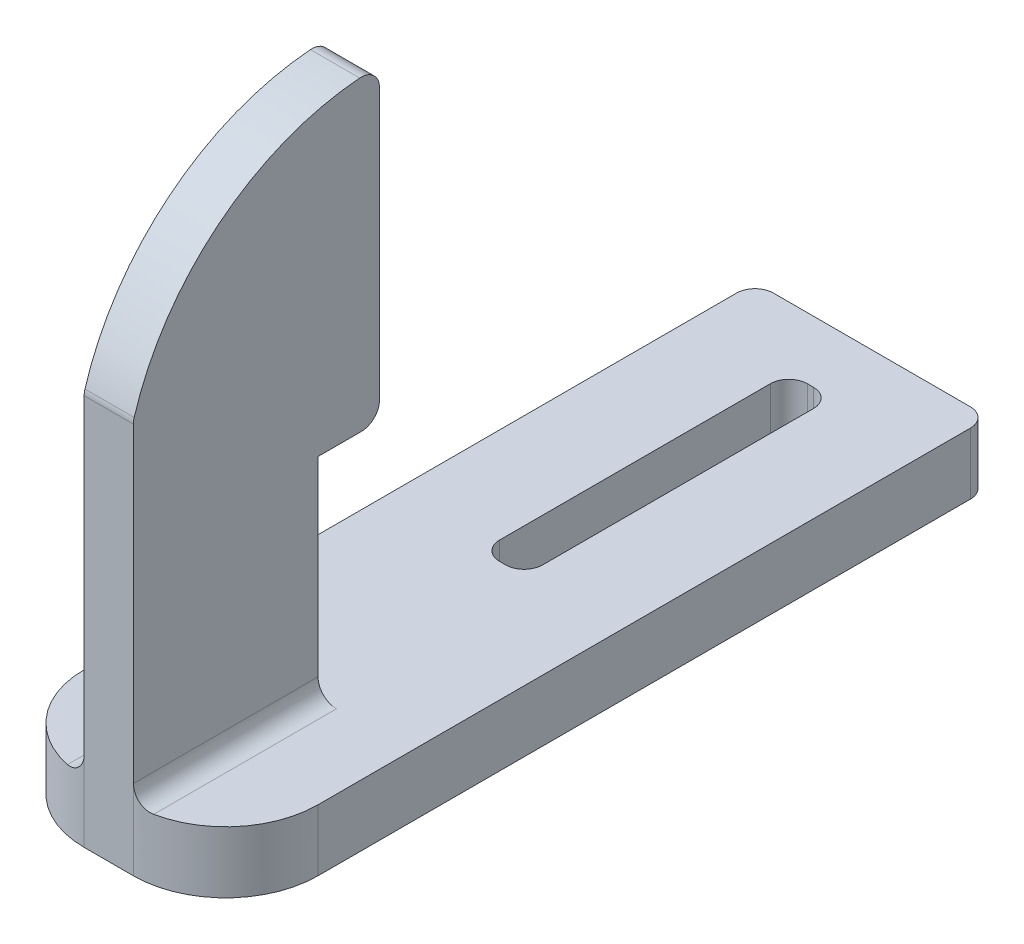
ISO-10303-21;
HEADER;
FILE_DESCRIPTION(('STEP AP214'),'2;1');
FILE_NAME('part.step','',(''),(''),'','','');
FILE_SCHEMA(('AUTOMOTIVE_DESIGN { 1 0 10303 214 1 1 1 1 }'));
ENDSEC;
DATA;
#1=APPLICATION_CONTEXT('core data for automotive mechanical design processes');
#2=APPLICATION_PROTOCOL_DEFINITION('international standard','automotive_design',2000,#1);
#3=PRODUCT_CONTEXT('',#1,'mechanical');
#4=PRODUCT('Part','Part','',(#3));
#5=PRODUCT_RELATED_PRODUCT_CATEGORY('part','',(#4));
#6=PRODUCT_DEFINITION_FORMATION('','',#4);
#7=PRODUCT_DEFINITION_CONTEXT('part definition',#1,'design');
#8=PRODUCT_DEFINITION('design','',#6,#7);
#9=PRODUCT_DEFINITION_SHAPE('','',#8);
#10=(LENGTH_UNIT() NAMED_UNIT(*) SI_UNIT(.MILLI.,.METRE.));
#11=(NAMED_UNIT(*) PLANE_ANGLE_UNIT() SI_UNIT($,.RADIAN.));
#12=(NAMED_UNIT(*) SI_UNIT($,.STERADIAN.) SOLID_ANGLE_UNIT());
#13=UNCERTAINTY_MEASURE_WITH_UNIT(LENGTH_MEASURE(1.E-05),#10,'distance_accuracy_value','');
#14=(GEOMETRIC_REPRESENTATION_CONTEXT(3) GLOBAL_UNCERTAINTY_ASSIGNED_CONTEXT((#13)) GLOBAL_UNIT_ASSIGNED_CONTEXT((#10,
#11,#12)) REPRESENTATION_CONTEXT('',''));
#15=CARTESIAN_POINT('',(0.,0.,0.));
#16=DIRECTION('',(0.,0.,1.));
#17=DIRECTION('',(1.,0.,0.));
#18=AXIS2_PLACEMENT_3D('',#15,#16,#17);
#19=CARTESIAN_POINT('',(-19.,5.,0.));
#20=DIRECTION('',(1.,0.,0.));
#21=DIRECTION('',(0.,0.,-1.));
#22=AXIS2_PLACEMENT_3D('',#19,#20,#21);
#23=PLANE('',#22);
#24=DIRECTION('',(0.,0.,1.));
#25=VECTOR('',#24,1.);
#26=CARTESIAN_POINT('',(-19.,5.,0.));
#27=LINE('',#26,#25);
#28=CARTESIAN_POINT('',(-19.,5.,-60.5));
#29=VERTEX_POINT('',#28);
#30=CARTESIAN_POINT('',(-19.,5.,-7.5));
#31=VERTEX_POINT('',#30);
#32=EDGE_CURVE('E211',#29,#31,#27,.T.);
#33=ORIENTED_EDGE('',*,*,#32,.F.);
#34=DIRECTION('',(0.,-1.,0.));
#35=VECTOR('',#34,1.);
#36=CARTESIAN_POINT('',(-19.,5.,-60.5));
#37=LINE('',#36,#35);
#38=CARTESIAN_POINT('',(-19.,0.,-60.5));
#39=VERTEX_POINT('',#38);
#40=EDGE_CURVE('E179',#29,#39,#37,.T.);
#41=ORIENTED_EDGE('',*,*,#40,.T.);
#42=DIRECTION('',(0.,0.,1.));
#43=VECTOR('',#42,1.);
#44=CARTESIAN_POINT('',(-19.,0.,0.));
#45=LINE('',#44,#43);
#46=CARTESIAN_POINT('',(-19.,0.,-7.5));
#47=VERTEX_POINT('',#46);
#48=EDGE_CURVE('E194',#39,#47,#45,.T.);
#49=ORIENTED_EDGE('',*,*,#48,.T.);
#50=DIRECTION('',(0.,1.,0.));
#51=VECTOR('',#50,1.);
#52=CARTESIAN_POINT('',(-19.,0.,-7.5));
#53=LINE('',#52,#51);
#54=EDGE_CURVE('E481',#47,#31,#53,.T.);
#55=ORIENTED_EDGE('',*,*,#54,.T.);
#56=EDGE_LOOP('',(#33,#41,#49,#55));
#57=FACE_BOUND('',#56,.T.);
#58=ADVANCED_FACE('F41',(#57),#23,.F.);
#59=CARTESIAN_POINT('',(0.,5.,0.));
#60=DIRECTION('',(0.,0.,-1.));
#61=DIRECTION('',(-1.,0.,0.));
#62=AXIS2_PLACEMENT_3D('',#59,#60,#61);
#63=PLANE('',#62);
#64=DIRECTION('',(0.,-1.,0.));
#65=VECTOR('',#64,1.);
#66=CARTESIAN_POINT('',(-7.5,22.,0.));
#67=LINE('',#66,#65);
#68=CARTESIAN_POINT('',(-7.5,31.781626842641,0.));
#69=VERTEX_POINT('',#68);
#70=CARTESIAN_POINT('',(-7.5,6.5,0.));
#71=VERTEX_POINT('',#70);
#72=EDGE_CURVE('E436',#69,#71,#67,.T.);
#73=ORIENTED_EDGE('',*,*,#72,.F.);
#74=DIRECTION('',(-1.,0.,0.));
#75=VECTOR('',#74,1.);
#76=CARTESIAN_POINT('',(-11.5,31.781626842641,0.));
#77=LINE('',#76,#75);
#78=CARTESIAN_POINT('',(-11.5,31.781626842641,0.));
#79=VERTEX_POINT('',#78);
#80=EDGE_CURVE('E89',#69,#79,#77,.T.);
#81=ORIENTED_EDGE('',*,*,#80,.T.);
#82=DIRECTION('',(0.,-1.,0.));
#83=VECTOR('',#82,1.);
#84=CARTESIAN_POINT('',(-11.5,22.,0.));
#85=LINE('',#84,#83);
#86=CARTESIAN_POINT('',(-11.5,6.5,0.));
#87=VERTEX_POINT('',#86);
#88=EDGE_CURVE('E438',#79,#87,#85,.T.);
#89=ORIENTED_EDGE('',*,*,#88,.T.);
#90=DIRECTION('',(0.,1.,0.));
#91=VECTOR('',#90,1.);
#92=CARTESIAN_POINT('',(-11.5,0.,0.));
#93=LINE('',#92,#91);
#94=CARTESIAN_POINT('',(-11.5,0.,0.));
#95=VERTEX_POINT('',#94);
#96=EDGE_CURVE('E79',#95,#87,#93,.T.);
#97=ORIENTED_EDGE('',*,*,#96,.F.);
#98=DIRECTION('',(1.,0.,0.));
#99=VECTOR('',#98,1.);
#100=CARTESIAN_POINT('',(0.,0.,0.));
#101=LINE('',#100,#99);
#102=CARTESIAN_POINT('',(-7.5,0.,0.));
#103=VERTEX_POINT('',#102);
#104=EDGE_CURVE('E199',#95,#103,#101,.T.);
#105=ORIENTED_EDGE('',*,*,#104,.T.);
#106=DIRECTION('',(0.,1.,0.));
#107=VECTOR('',#106,1.);
#108=CARTESIAN_POINT('',(-7.5,0.,0.));
#109=LINE('',#108,#107);
#110=EDGE_CURVE('E56',#103,#71,#109,.T.);
#111=ORIENTED_EDGE('',*,*,#110,.T.);
#112=EDGE_LOOP('',(#73,#81,#89,#97,#105,#111));
#113=FACE_BOUND('',#112,.T.);
#114=ADVANCED_FACE('F367',(#113),#63,.F.);
#115=CARTESIAN_POINT('',(0.,5.,0.));
#116=DIRECTION('',(0.,1.,0.));
#117=DIRECTION('',(0.,0.,1.));
#118=AXIS2_PLACEMENT_3D('',#115,#116,#117);
#119=PLANE('',#118);
#120=CARTESIAN_POINT('',(-11.5,5.,-7.5));
#121=DIRECTION('',(0.,-1.,0.));
#122=DIRECTION('',(0.,0.,1.));
#123=AXIS2_PLACEMENT_3D('',#120,#121,#122);
#124=CIRCLE('',#123,7.5);
#125=CARTESIAN_POINT('',(-13.,5.,-0.151530771650465));
#126=VERTEX_POINT('',#125);
#127=EDGE_CURVE('E472',#126,#31,#124,.T.);
#128=ORIENTED_EDGE('',*,*,#127,.F.);
#129=DIRECTION('',(0.,0.,1.));
#130=VECTOR('',#129,1.);
#131=CARTESIAN_POINT('',(-13.,5.,0.));
#132=LINE('',#131,#130);
#133=CARTESIAN_POINT('',(-13.,5.,-15.));
#134=VERTEX_POINT('',#133);
#135=EDGE_CURVE('E249',#126,#134,#132,.F.);
#136=ORIENTED_EDGE('',*,*,#135,.T.);
#137=DIRECTION('',(-1.,0.,0.));
#138=VECTOR('',#137,1.);
#139=CARTESIAN_POINT('',(-11.5,5.,-15.));
#140=LINE('',#139,#138);
#141=CARTESIAN_POINT('',(-6.,5.,-15.));
#142=VERTEX_POINT('',#141);
#143=EDGE_CURVE('E412',#142,#134,#140,.T.);
#144=ORIENTED_EDGE('',*,*,#143,.F.);
#145=DIRECTION('',(0.,0.,-1.));
#146=VECTOR('',#145,1.);
#147=CARTESIAN_POINT('',(-6.,5.,0.));
#148=LINE('',#147,#146);
#149=CARTESIAN_POINT('',(-6.,5.,-0.151530771650464));
#150=VERTEX_POINT('',#149);
#151=EDGE_CURVE('E247',#142,#150,#148,.F.);
#152=ORIENTED_EDGE('',*,*,#151,.T.);
#153=CARTESIAN_POINT('',(-7.5,5.,-7.5));
#154=DIRECTION('',(0.,-1.,0.));
#155=DIRECTION('',(0.,0.,-1.));
#156=AXIS2_PLACEMENT_3D('',#153,#154,#155);
#157=CIRCLE('',#156,7.5);
#158=CARTESIAN_POINT('',(0.,5.,-7.5));
#159=VERTEX_POINT('',#158);
#160=EDGE_CURVE('E484',#159,#150,#157,.T.);
#161=ORIENTED_EDGE('',*,*,#160,.F.);
#162=DIRECTION('',(0.,0.,-1.));
#163=VECTOR('',#162,1.);
#164=CARTESIAN_POINT('',(0.,5.,0.));
#165=LINE('',#164,#163);
#166=CARTESIAN_POINT('',(0.,5.,-60.5));
#167=VERTEX_POINT('',#166);
#168=EDGE_CURVE('E206',#159,#167,#165,.T.);
#169=ORIENTED_EDGE('',*,*,#168,.T.);
#170=CARTESIAN_POINT('',(-1.5,5.,-60.5));
#171=DIRECTION('',(0.,1.,0.));
#172=DIRECTION('',(0.,0.,1.));
#173=AXIS2_PLACEMENT_3D('',#170,#171,#172);
#174=CIRCLE('',#173,1.5);
#175=CARTESIAN_POINT('',(-1.5,5.,-62.));
#176=VERTEX_POINT('',#175);
#177=EDGE_CURVE('E243',#167,#176,#174,.T.);
#178=ORIENTED_EDGE('',*,*,#177,.T.);
#179=DIRECTION('',(-1.,0.,0.));
#180=VECTOR('',#179,1.);
#181=CARTESIAN_POINT('',(0.,5.,-62.));
#182=LINE('',#181,#180);
#183=CARTESIAN_POINT('',(-17.5,5.,-62.));
#184=VERTEX_POINT('',#183);
#185=EDGE_CURVE('E188',#176,#184,#182,.T.);
#186=ORIENTED_EDGE('',*,*,#185,.T.);
#187=CARTESIAN_POINT('',(-17.5,5.,-60.5));
#188=DIRECTION('',(0.,1.,0.));
#189=DIRECTION('',(0.,0.,1.));
#190=AXIS2_PLACEMENT_3D('',#187,#188,#189);
#191=CIRCLE('',#190,1.5);
#192=EDGE_CURVE('E245',#184,#29,#191,.T.);
#193=ORIENTED_EDGE('',*,*,#192,.T.);
#194=ORIENTED_EDGE('',*,*,#32,.T.);
#195=EDGE_LOOP('',(#128,#136,#144,#152,#161,#169,#178,#186,#193,#194));
#196=FACE_BOUND('',#195,.T.);
#197=DIRECTION('',(1.,0.,0.));
#198=VECTOR('',#197,1.);
#199=CARTESIAN_POINT('',(-11.25,5.,-32.));
#200=LINE('',#199,#198);
#201=CARTESIAN_POINT('',(-9.75,5.,-32.));
#202=VERTEX_POINT('',#201);
#203=CARTESIAN_POINT('',(-9.25,5.,-32.));
#204=VERTEX_POINT('',#203);
#205=EDGE_CURVE('E444',#202,#204,#200,.T.);
#206=ORIENTED_EDGE('',*,*,#205,.F.);
#207=CARTESIAN_POINT('',(-9.75,5.,-33.5));
#208=DIRECTION('',(0.,1.,0.));
#209=DIRECTION('',(0.,0.,1.));
#210=AXIS2_PLACEMENT_3D('',#207,#208,#209);
#211=CIRCLE('',#210,1.5);
#212=CARTESIAN_POINT('',(-11.25,5.,-33.5));
#213=VERTEX_POINT('',#212);
#214=EDGE_CURVE('E11',#202,#213,#211,.F.);
#215=ORIENTED_EDGE('',*,*,#214,.T.);
#216=DIRECTION('',(0.,0.,1.));
#217=VECTOR('',#216,1.);
#218=CARTESIAN_POINT('',(-11.25,5.,-57.));
#219=LINE('',#218,#217);
#220=CARTESIAN_POINT('',(-11.25,5.,-55.5));
#221=VERTEX_POINT('',#220);
#222=EDGE_CURVE('E441',#221,#213,#219,.T.);
#223=ORIENTED_EDGE('',*,*,#222,.F.);
#224=CARTESIAN_POINT('',(-9.75,5.,-55.5));
#225=DIRECTION('',(0.,1.,0.));
#226=DIRECTION('',(0.,0.,1.));
#227=AXIS2_PLACEMENT_3D('',#224,#225,#226);
#228=CIRCLE('',#227,1.5);
#229=CARTESIAN_POINT('',(-9.75,5.,-57.));
#230=VERTEX_POINT('',#229);
#231=EDGE_CURVE('E580',#221,#230,#228,.F.);
#232=ORIENTED_EDGE('',*,*,#231,.T.);
#233=DIRECTION('',(-1.,0.,0.));
#234=VECTOR('',#233,1.);
#235=CARTESIAN_POINT('',(-11.25,5.,-57.));
#236=LINE('',#235,#234);
#237=CARTESIAN_POINT('',(-9.25,5.,-57.));
#238=VERTEX_POINT('',#237);
#239=EDGE_CURVE('E201',#238,#230,#236,.T.);
#240=ORIENTED_EDGE('',*,*,#239,.F.);
#241=CARTESIAN_POINT('',(-9.25,5.,-55.5));
#242=DIRECTION('',(0.,1.,0.));
#243=DIRECTION('',(0.,0.,1.));
#244=AXIS2_PLACEMENT_3D('',#241,#242,#243);
#245=CIRCLE('',#244,1.5);
#246=CARTESIAN_POINT('',(-7.75,5.,-55.5));
#247=VERTEX_POINT('',#246);
#248=EDGE_CURVE('E572',#238,#247,#245,.F.);
#249=ORIENTED_EDGE('',*,*,#248,.T.);
#250=DIRECTION('',(0.,0.,-1.));
#251=VECTOR('',#250,1.);
#252=CARTESIAN_POINT('',(-7.75,5.,-57.));
#253=LINE('',#252,#251);
#254=CARTESIAN_POINT('',(-7.75,5.,-33.5));
#255=VERTEX_POINT('',#254);
#256=EDGE_CURVE('E448',#255,#247,#253,.T.);
#257=ORIENTED_EDGE('',*,*,#256,.F.);
#258=CARTESIAN_POINT('',(-9.25,5.,-33.5));
#259=DIRECTION('',(0.,1.,0.));
#260=DIRECTION('',(0.,0.,1.));
#261=AXIS2_PLACEMENT_3D('',#258,#259,#260);
#262=CIRCLE('',#261,1.5);
#263=EDGE_CURVE('E578',#255,#204,#262,.F.);
#264=ORIENTED_EDGE('',*,*,#263,.T.);
#265=EDGE_LOOP('',(#206,#215,#223,#232,#240,#249,#257,#264));
#266=FACE_BOUND('',#265,.T.);
#267=ADVANCED_FACE('F364',(#196,#266),#119,.T.);
#268=CARTESIAN_POINT('',(0.,0.,0.));
#269=DIRECTION('',(0.,1.,0.));
#270=DIRECTION('',(0.,0.,1.));
#271=AXIS2_PLACEMENT_3D('',#268,#269,#270);
#272=PLANE('',#271);
#273=ORIENTED_EDGE('',*,*,#48,.F.);
#274=CARTESIAN_POINT('',(-17.5,0.,-60.5));
#275=DIRECTION('',(0.,1.,0.));
#276=DIRECTION('',(0.,0.,1.));
#277=AXIS2_PLACEMENT_3D('',#274,#275,#276);
#278=CIRCLE('',#277,1.5);
#279=CARTESIAN_POINT('',(-17.5,0.,-62.));
#280=VERTEX_POINT('',#279);
#281=EDGE_CURVE('E178',#39,#280,#278,.F.);
#282=ORIENTED_EDGE('',*,*,#281,.T.);
#283=DIRECTION('',(-1.,0.,0.));
#284=VECTOR('',#283,1.);
#285=CARTESIAN_POINT('',(0.,0.,-62.));
#286=LINE('',#285,#284);
#287=CARTESIAN_POINT('',(-1.5,0.,-62.));
#288=VERTEX_POINT('',#287);
#289=EDGE_CURVE('E185',#288,#280,#286,.T.);
#290=ORIENTED_EDGE('',*,*,#289,.F.);
#291=CARTESIAN_POINT('',(-1.5,0.,-60.5));
#292=DIRECTION('',(0.,1.,0.));
#293=DIRECTION('',(0.,0.,1.));
#294=AXIS2_PLACEMENT_3D('',#291,#292,#293);
#295=CIRCLE('',#294,1.5);
#296=CARTESIAN_POINT('',(0.,0.,-60.5));
#297=VERTEX_POINT('',#296);
#298=EDGE_CURVE('E65',#288,#297,#295,.F.);
#299=ORIENTED_EDGE('',*,*,#298,.T.);
#300=DIRECTION('',(0.,0.,-1.));
#301=VECTOR('',#300,1.);
#302=CARTESIAN_POINT('',(0.,0.,0.));
#303=LINE('',#302,#301);
#304=CARTESIAN_POINT('',(0.,0.,-7.5));
#305=VERTEX_POINT('',#304);
#306=EDGE_CURVE('E195',#305,#297,#303,.T.);
#307=ORIENTED_EDGE('',*,*,#306,.F.);
#308=CARTESIAN_POINT('',(-7.5,0.,-7.5));
#309=DIRECTION('',(0.,-1.,0.));
#310=DIRECTION('',(0.,0.,-1.));
#311=AXIS2_PLACEMENT_3D('',#308,#309,#310);
#312=CIRCLE('',#311,7.5);
#313=EDGE_CURVE('E491',#305,#103,#312,.T.);
#314=ORIENTED_EDGE('',*,*,#313,.T.);
#315=ORIENTED_EDGE('',*,*,#104,.F.);
#316=CARTESIAN_POINT('',(-11.5,0.,-7.5));
#317=DIRECTION('',(0.,-1.,0.));
#318=DIRECTION('',(0.,0.,1.));
#319=AXIS2_PLACEMENT_3D('',#316,#317,#318);
#320=CIRCLE('',#319,7.5);
#321=EDGE_CURVE('E483',#95,#47,#320,.T.);
#322=ORIENTED_EDGE('',*,*,#321,.T.);
#323=EDGE_LOOP('',(#273,#282,#290,#299,#307,#314,#315,#322));
#324=FACE_BOUND('',#323,.T.);
#325=DIRECTION('',(-1.,0.,0.));
#326=VECTOR('',#325,1.);
#327=CARTESIAN_POINT('',(-11.25,0.,-57.));
#328=LINE('',#327,#326);
#329=CARTESIAN_POINT('',(-9.25,0.,-57.));
#330=VERTEX_POINT('',#329);
#331=CARTESIAN_POINT('',(-9.75,0.,-57.));
#332=VERTEX_POINT('',#331);
#333=EDGE_CURVE('E445',#330,#332,#328,.T.);
#334=ORIENTED_EDGE('',*,*,#333,.T.);
#335=CARTESIAN_POINT('',(-9.75,0.,-55.5));
#336=DIRECTION('',(0.,1.,0.));
#337=DIRECTION('',(0.,0.,1.));
#338=AXIS2_PLACEMENT_3D('',#335,#336,#337);
#339=CIRCLE('',#338,1.5);
#340=CARTESIAN_POINT('',(-11.25,0.,-55.5));
#341=VERTEX_POINT('',#340);
#342=EDGE_CURVE('E316',#332,#341,#339,.T.);
#343=ORIENTED_EDGE('',*,*,#342,.T.);
#344=DIRECTION('',(0.,0.,1.));
#345=VECTOR('',#344,1.);
#346=CARTESIAN_POINT('',(-11.25,0.,-57.));
#347=LINE('',#346,#345);
#348=CARTESIAN_POINT('',(-11.25,0.,-33.5));
#349=VERTEX_POINT('',#348);
#350=EDGE_CURVE('E440',#341,#349,#347,.T.);
#351=ORIENTED_EDGE('',*,*,#350,.T.);
#352=CARTESIAN_POINT('',(-9.75,0.,-33.5));
#353=DIRECTION('',(0.,1.,0.));
#354=DIRECTION('',(0.,0.,1.));
#355=AXIS2_PLACEMENT_3D('',#352,#353,#354);
#356=CIRCLE('',#355,1.5);
#357=CARTESIAN_POINT('',(-9.75,0.,-32.));
#358=VERTEX_POINT('',#357);
#359=EDGE_CURVE('E49',#349,#358,#356,.T.);
#360=ORIENTED_EDGE('',*,*,#359,.T.);
#361=DIRECTION('',(1.,0.,0.));
#362=VECTOR('',#361,1.);
#363=CARTESIAN_POINT('',(-11.25,0.,-32.));
#364=LINE('',#363,#362);
#365=CARTESIAN_POINT('',(-9.25,0.,-32.));
#366=VERTEX_POINT('',#365);
#367=EDGE_CURVE('E455',#358,#366,#364,.T.);
#368=ORIENTED_EDGE('',*,*,#367,.T.);
#369=CARTESIAN_POINT('',(-9.25,0.,-33.5));
#370=DIRECTION('',(0.,1.,0.));
#371=DIRECTION('',(0.,0.,1.));
#372=AXIS2_PLACEMENT_3D('',#369,#370,#371);
#373=CIRCLE('',#372,1.5);
#374=CARTESIAN_POINT('',(-7.75,0.,-33.5));
#375=VERTEX_POINT('',#374);
#376=EDGE_CURVE('E575',#366,#375,#373,.T.);
#377=ORIENTED_EDGE('',*,*,#376,.T.);
#378=DIRECTION('',(0.,0.,-1.));
#379=VECTOR('',#378,1.);
#380=CARTESIAN_POINT('',(-7.75,0.,-57.));
#381=LINE('',#380,#379);
#382=CARTESIAN_POINT('',(-7.75,0.,-55.5));
#383=VERTEX_POINT('',#382);
#384=EDGE_CURVE('E458',#375,#383,#381,.T.);
#385=ORIENTED_EDGE('',*,*,#384,.T.);
#386=CARTESIAN_POINT('',(-9.25,0.,-55.5));
#387=DIRECTION('',(0.,1.,0.));
#388=DIRECTION('',(0.,0.,1.));
#389=AXIS2_PLACEMENT_3D('',#386,#387,#388);
#390=CIRCLE('',#389,1.5);
#391=EDGE_CURVE('E576',#383,#330,#390,.T.);
#392=ORIENTED_EDGE('',*,*,#391,.T.);
#393=EDGE_LOOP('',(#334,#343,#351,#360,#368,#377,#385,#392));
#394=FACE_BOUND('',#393,.T.);
#395=ADVANCED_FACE('F192',(#324,#394),#272,.F.);
#396=CARTESIAN_POINT('',(0.,5.,0.));
#397=DIRECTION('',(-1.,0.,0.));
#398=DIRECTION('',(0.,0.,1.));
#399=AXIS2_PLACEMENT_3D('',#396,#397,#398);
#400=PLANE('',#399);
#401=ORIENTED_EDGE('',*,*,#306,.T.);
#402=DIRECTION('',(0.,-1.,0.));
#403=VECTOR('',#402,1.);
#404=CARTESIAN_POINT('',(0.,5.,-60.5));
#405=LINE('',#404,#403);
#406=EDGE_CURVE('E177',#297,#167,#405,.F.);
#407=ORIENTED_EDGE('',*,*,#406,.T.);
#408=ORIENTED_EDGE('',*,*,#168,.F.);
#409=DIRECTION('',(0.,1.,0.));
#410=VECTOR('',#409,1.);
#411=CARTESIAN_POINT('',(0.,0.,-7.5));
#412=LINE('',#411,#410);
#413=EDGE_CURVE('E492',#305,#159,#412,.T.);
#414=ORIENTED_EDGE('',*,*,#413,.F.);
#415=EDGE_LOOP('',(#401,#407,#408,#414));
#416=FACE_BOUND('',#415,.T.);
#417=ADVANCED_FACE('F371',(#416),#400,.F.);
#418=CARTESIAN_POINT('',(0.,5.,-62.));
#419=DIRECTION('',(0.,0.,1.));
#420=DIRECTION('',(1.,0.,0.));
#421=AXIS2_PLACEMENT_3D('',#418,#419,#420);
#422=PLANE('',#421);
#423=ORIENTED_EDGE('',*,*,#289,.T.);
#424=DIRECTION('',(0.,-1.,0.));
#425=VECTOR('',#424,1.);
#426=CARTESIAN_POINT('',(-17.5,5.,-62.));
#427=LINE('',#426,#425);
#428=EDGE_CURVE('E189',#280,#184,#427,.F.);
#429=ORIENTED_EDGE('',*,*,#428,.T.);
#430=ORIENTED_EDGE('',*,*,#185,.F.);
#431=DIRECTION('',(0.,-1.,0.));
#432=VECTOR('',#431,1.);
#433=CARTESIAN_POINT('',(-1.5,5.,-62.));
#434=LINE('',#433,#432);
#435=EDGE_CURVE('E176',#176,#288,#434,.T.);
#436=ORIENTED_EDGE('',*,*,#435,.T.);
#437=EDGE_LOOP('',(#423,#429,#430,#436));
#438=FACE_BOUND('',#437,.T.);
#439=ADVANCED_FACE('F184',(#438),#422,.F.);
#440=CARTESIAN_POINT('',(-11.25,5.,-57.));
#441=DIRECTION('',(1.,0.,0.));
#442=DIRECTION('',(0.,0.,-1.));
#443=AXIS2_PLACEMENT_3D('',#440,#441,#442);
#444=PLANE('',#443);
#445=ORIENTED_EDGE('',*,*,#350,.F.);
#446=DIRECTION('',(0.,-1.,0.));
#447=VECTOR('',#446,1.);
#448=CARTESIAN_POINT('',(-11.25,5.,-55.5));
#449=LINE('',#448,#447);
#450=EDGE_CURVE('E260',#341,#221,#449,.F.);
#451=ORIENTED_EDGE('',*,*,#450,.T.);
#452=ORIENTED_EDGE('',*,*,#222,.T.);
#453=DIRECTION('',(0.,-1.,0.));
#454=VECTOR('',#453,1.);
#455=CARTESIAN_POINT('',(-11.25,0.,-33.5));
#456=LINE('',#455,#454);
#457=EDGE_CURVE('E257',#213,#349,#456,.T.);
#458=ORIENTED_EDGE('',*,*,#457,.T.);
#459=EDGE_LOOP('',(#445,#451,#452,#458));
#460=FACE_BOUND('',#459,.T.);
#461=ADVANCED_FACE('F359',(#460),#444,.T.);
#462=CARTESIAN_POINT('',(-11.25,5.,-32.));
#463=DIRECTION('',(0.,0.,-1.));
#464=DIRECTION('',(-1.,0.,0.));
#465=AXIS2_PLACEMENT_3D('',#462,#463,#464);
#466=PLANE('',#465);
#467=ORIENTED_EDGE('',*,*,#205,.T.);
#468=DIRECTION('',(0.,-1.,0.));
#469=VECTOR('',#468,1.);
#470=CARTESIAN_POINT('',(-9.25,0.,-32.));
#471=LINE('',#470,#469);
#472=EDGE_CURVE('E269',#204,#366,#471,.T.);
#473=ORIENTED_EDGE('',*,*,#472,.T.);
#474=ORIENTED_EDGE('',*,*,#367,.F.);
#475=DIRECTION('',(0.,-1.,0.));
#476=VECTOR('',#475,1.);
#477=CARTESIAN_POINT('',(-9.75,5.,-32.));
#478=LINE('',#477,#476);
#479=EDGE_CURVE('E267',#358,#202,#478,.F.);
#480=ORIENTED_EDGE('',*,*,#479,.T.);
#481=EDGE_LOOP('',(#467,#473,#474,#480));
#482=FACE_BOUND('',#481,.T.);
#483=ADVANCED_FACE('F355',(#482),#466,.T.);
#484=CARTESIAN_POINT('',(-7.75,5.,-57.));
#485=DIRECTION('',(-1.,0.,0.));
#486=DIRECTION('',(0.,0.,1.));
#487=AXIS2_PLACEMENT_3D('',#484,#485,#486);
#488=PLANE('',#487);
#489=ORIENTED_EDGE('',*,*,#256,.T.);
#490=DIRECTION('',(0.,-1.,0.));
#491=VECTOR('',#490,1.);
#492=CARTESIAN_POINT('',(-7.75,0.,-55.5));
#493=LINE('',#492,#491);
#494=EDGE_CURVE('E264',#247,#383,#493,.T.);
#495=ORIENTED_EDGE('',*,*,#494,.T.);
#496=ORIENTED_EDGE('',*,*,#384,.F.);
#497=DIRECTION('',(0.,-1.,0.));
#498=VECTOR('',#497,1.);
#499=CARTESIAN_POINT('',(-7.75,5.,-33.5));
#500=LINE('',#499,#498);
#501=EDGE_CURVE('E262',#375,#255,#500,.F.);
#502=ORIENTED_EDGE('',*,*,#501,.T.);
#503=EDGE_LOOP('',(#489,#495,#496,#502));
#504=FACE_BOUND('',#503,.T.);
#505=ADVANCED_FACE('F351',(#504),#488,.T.);
#506=CARTESIAN_POINT('',(-11.25,5.,-57.));
#507=DIRECTION('',(0.,0.,1.));
#508=DIRECTION('',(1.,0.,0.));
#509=AXIS2_PLACEMENT_3D('',#506,#507,#508);
#510=PLANE('',#509);
#511=ORIENTED_EDGE('',*,*,#239,.T.);
#512=DIRECTION('',(0.,-1.,0.));
#513=VECTOR('',#512,1.);
#514=CARTESIAN_POINT('',(-9.75,0.,-57.));
#515=LINE('',#514,#513);
#516=EDGE_CURVE('E254',#230,#332,#515,.T.);
#517=ORIENTED_EDGE('',*,*,#516,.T.);
#518=ORIENTED_EDGE('',*,*,#333,.F.);
#519=DIRECTION('',(0.,-1.,0.));
#520=VECTOR('',#519,1.);
#521=CARTESIAN_POINT('',(-9.25,5.,-57.));
#522=LINE('',#521,#520);
#523=EDGE_CURVE('E252',#330,#238,#522,.F.);
#524=ORIENTED_EDGE('',*,*,#523,.T.);
#525=EDGE_LOOP('',(#511,#517,#518,#524));
#526=FACE_BOUND('',#525,.T.);
#527=ADVANCED_FACE('F347',(#526),#510,.T.);
#528=CARTESIAN_POINT('',(-11.5,22.,-15.));
#529=DIRECTION('',(1.,0.,0.));
#530=DIRECTION('',(0.,0.,-1.));
#531=AXIS2_PLACEMENT_3D('',#528,#529,#530);
#532=PLANE('',#531);
#533=CARTESIAN_POINT('',(-11.5,26.1666666666667,-20.));
#534=DIRECTION('',(1.,0.,0.));
#535=DIRECTION('',(0.,0.,1.));
#536=AXIS2_PLACEMENT_3D('',#533,#534,#535);
#537=CIRCLE('',#536,20.8333333333333);
#538=CARTESIAN_POINT('',(-11.5,46.9372009809992,-18.3836206896552));
#539=VERTEX_POINT('',#538);
#540=CARTESIAN_POINT('',(-11.5,32.2172703045701,-0.0646551724137953));
#541=VERTEX_POINT('',#540);
#542=EDGE_CURVE('E403',#539,#541,#537,.T.);
#543=ORIENTED_EDGE('',*,*,#542,.F.);
#544=CARTESIAN_POINT('',(-11.5,45.4417225103673,-18.5));
#545=DIRECTION('',(1.,0.,0.));
#546=DIRECTION('',(0.,0.,-1.));
#547=AXIS2_PLACEMENT_3D('',#544,#545,#546);
#548=CIRCLE('',#547,1.5);
#549=CARTESIAN_POINT('',(-11.5,45.4417225103673,-20.));
#550=VERTEX_POINT('',#549);
#551=EDGE_CURVE('E239',#539,#550,#548,.F.);
#552=ORIENTED_EDGE('',*,*,#551,.T.);
#553=DIRECTION('',(0.,1.,0.));
#554=VECTOR('',#553,1.);
#555=CARTESIAN_POINT('',(-11.5,22.,-20.));
#556=LINE('',#555,#554);
#557=CARTESIAN_POINT('',(-11.5,23.5,-20.));
#558=VERTEX_POINT('',#557);
#559=EDGE_CURVE('E400',#558,#550,#556,.T.);
#560=ORIENTED_EDGE('',*,*,#559,.F.);
#561=CARTESIAN_POINT('',(-11.5,23.5,-18.5));
#562=DIRECTION('',(1.,0.,0.));
#563=DIRECTION('',(0.,0.,-1.));
#564=AXIS2_PLACEMENT_3D('',#561,#562,#563);
#565=CIRCLE('',#564,1.5);
#566=CARTESIAN_POINT('',(-11.5,22.,-18.5));
#567=VERTEX_POINT('',#566);
#568=EDGE_CURVE('E232',#558,#567,#565,.F.);
#569=ORIENTED_EDGE('',*,*,#568,.T.);
#570=DIRECTION('',(0.,0.,-1.));
#571=VECTOR('',#570,1.);
#572=CARTESIAN_POINT('',(-11.5,22.,0.));
#573=LINE('',#572,#571);
#574=CARTESIAN_POINT('',(-11.5,22.,-15.));
#575=VERTEX_POINT('',#574);
#576=EDGE_CURVE('E410',#575,#567,#573,.T.);
#577=ORIENTED_EDGE('',*,*,#576,.F.);
#578=DIRECTION('',(0.,-1.,0.));
#579=VECTOR('',#578,1.);
#580=CARTESIAN_POINT('',(-11.5,22.,-15.));
#581=LINE('',#580,#579);
#582=CARTESIAN_POINT('',(-11.5,6.5,-15.));
#583=VERTEX_POINT('',#582);
#584=EDGE_CURVE('E429',#575,#583,#581,.T.);
#585=ORIENTED_EDGE('',*,*,#584,.T.);
#586=DIRECTION('',(0.,0.,1.));
#587=VECTOR('',#586,1.);
#588=CARTESIAN_POINT('',(-11.5,6.5,-15.));
#589=LINE('',#588,#587);
#590=EDGE_CURVE('E234',#583,#87,#589,.T.);
#591=ORIENTED_EDGE('',*,*,#590,.T.);
#592=ORIENTED_EDGE('',*,*,#88,.F.);
#593=CARTESIAN_POINT('',(-11.5,31.781626842641,-1.5));
#594=DIRECTION('',(1.,0.,0.));
#595=DIRECTION('',(0.,0.,-1.));
#596=AXIS2_PLACEMENT_3D('',#593,#594,#595);
#597=CIRCLE('',#596,1.5);
#598=EDGE_CURVE('E237',#79,#541,#597,.F.);
#599=ORIENTED_EDGE('',*,*,#598,.T.);
#600=EDGE_LOOP('',(#543,#552,#560,#569,#577,#585,#591,#592,#599));
#601=FACE_BOUND('',#600,.T.);
#602=ADVANCED_FACE('F343',(#601),#532,.F.);
#603=CARTESIAN_POINT('',(-7.5,22.,-15.));
#604=DIRECTION('',(-1.,0.,0.));
#605=DIRECTION('',(0.,0.,1.));
#606=AXIS2_PLACEMENT_3D('',#603,#604,#605);
#607=PLANE('',#606);
#608=DIRECTION('',(0.,1.,0.));
#609=VECTOR('',#608,1.);
#610=CARTESIAN_POINT('',(-7.5,22.,-20.));
#611=LINE('',#610,#609);
#612=CARTESIAN_POINT('',(-7.5,23.5,-20.));
#613=VERTEX_POINT('',#612);
#614=CARTESIAN_POINT('',(-7.5,45.4417225103673,-20.));
#615=VERTEX_POINT('',#614);
#616=EDGE_CURVE('E422',#613,#615,#611,.T.);
#617=ORIENTED_EDGE('',*,*,#616,.T.);
#618=CARTESIAN_POINT('',(-7.5,45.4417225103673,-18.5));
#619=DIRECTION('',(-1.,0.,0.));
#620=DIRECTION('',(0.,0.,1.));
#621=AXIS2_PLACEMENT_3D('',#618,#619,#620);
#622=CIRCLE('',#621,1.5);
#623=CARTESIAN_POINT('',(-7.5,46.9372009809992,-18.3836206896552));
#624=VERTEX_POINT('',#623);
#625=EDGE_CURVE('E223',#615,#624,#622,.F.);
#626=ORIENTED_EDGE('',*,*,#625,.T.);
#627=CARTESIAN_POINT('',(-7.5,26.1666666666667,-20.));
#628=DIRECTION('',(1.,0.,0.));
#629=DIRECTION('',(0.,0.,1.));
#630=AXIS2_PLACEMENT_3D('',#627,#628,#629);
#631=CIRCLE('',#630,20.8333333333333);
#632=CARTESIAN_POINT('',(-7.5,32.2172703045701,-0.0646551724137953));
#633=VERTEX_POINT('',#632);
#634=EDGE_CURVE('E415',#624,#633,#631,.T.);
#635=ORIENTED_EDGE('',*,*,#634,.T.);
#636=CARTESIAN_POINT('',(-7.5,31.781626842641,-1.5));
#637=DIRECTION('',(-1.,0.,0.));
#638=DIRECTION('',(0.,0.,1.));
#639=AXIS2_PLACEMENT_3D('',#636,#637,#638);
#640=CIRCLE('',#639,1.5);
#641=EDGE_CURVE('E220',#633,#69,#640,.F.);
#642=ORIENTED_EDGE('',*,*,#641,.T.);
#643=ORIENTED_EDGE('',*,*,#72,.T.);
#644=DIRECTION('',(0.,0.,-1.));
#645=VECTOR('',#644,1.);
#646=CARTESIAN_POINT('',(-7.5,6.5,-15.));
#647=LINE('',#646,#645);
#648=CARTESIAN_POINT('',(-7.5,6.5,-15.));
#649=VERTEX_POINT('',#648);
#650=EDGE_CURVE('E217',#71,#649,#647,.T.);
#651=ORIENTED_EDGE('',*,*,#650,.T.);
#652=DIRECTION('',(0.,-1.,0.));
#653=VECTOR('',#652,1.);
#654=CARTESIAN_POINT('',(-7.5,22.,-15.));
#655=LINE('',#654,#653);
#656=CARTESIAN_POINT('',(-7.5,22.,-15.));
#657=VERTEX_POINT('',#656);
#658=EDGE_CURVE('E433',#657,#649,#655,.T.);
#659=ORIENTED_EDGE('',*,*,#658,.F.);
#660=DIRECTION('',(0.,0.,-1.));
#661=VECTOR('',#660,1.);
#662=CARTESIAN_POINT('',(-7.5,22.,-15.));
#663=LINE('',#662,#661);
#664=CARTESIAN_POINT('',(-7.5,22.,-18.5));
#665=VERTEX_POINT('',#664);
#666=EDGE_CURVE('E419',#657,#665,#663,.T.);
#667=ORIENTED_EDGE('',*,*,#666,.T.);
#668=CARTESIAN_POINT('',(-7.5,23.5,-18.5));
#669=DIRECTION('',(-1.,0.,0.));
#670=DIRECTION('',(0.,0.,1.));
#671=AXIS2_PLACEMENT_3D('',#668,#669,#670);
#672=CIRCLE('',#671,1.5);
#673=EDGE_CURVE('E214',#665,#613,#672,.F.);
#674=ORIENTED_EDGE('',*,*,#673,.T.);
#675=EDGE_LOOP('',(#617,#626,#635,#642,#643,#651,#659,#667,#674));
#676=FACE_BOUND('',#675,.T.);
#677=ADVANCED_FACE('F339',(#676),#607,.F.);
#678=CARTESIAN_POINT('',(-11.5,22.,-15.));
#679=DIRECTION('',(0.,0.,1.));
#680=DIRECTION('',(1.,0.,0.));
#681=AXIS2_PLACEMENT_3D('',#678,#679,#680);
#682=PLANE('',#681);
#683=ORIENTED_EDGE('',*,*,#143,.T.);
#684=CARTESIAN_POINT('',(-13.,6.5,-15.));
#685=DIRECTION('',(0.,0.,1.));
#686=DIRECTION('',(1.,0.,0.));
#687=AXIS2_PLACEMENT_3D('',#684,#685,#686);
#688=CIRCLE('',#687,1.5);
#689=EDGE_CURVE('E288',#134,#583,#688,.T.);
#690=ORIENTED_EDGE('',*,*,#689,.T.);
#691=ORIENTED_EDGE('',*,*,#584,.F.);
#692=DIRECTION('',(-1.,0.,0.));
#693=VECTOR('',#692,1.);
#694=CARTESIAN_POINT('',(-11.5,22.,-15.));
#695=LINE('',#694,#693);
#696=EDGE_CURVE('E426',#657,#575,#695,.T.);
#697=ORIENTED_EDGE('',*,*,#696,.F.);
#698=ORIENTED_EDGE('',*,*,#658,.T.);
#699=CARTESIAN_POINT('',(-6.,6.5,-15.));
#700=DIRECTION('',(0.,0.,1.));
#701=DIRECTION('',(1.,0.,0.));
#702=AXIS2_PLACEMENT_3D('',#699,#700,#701);
#703=CIRCLE('',#702,1.5);
#704=EDGE_CURVE('E317',#649,#142,#703,.T.);
#705=ORIENTED_EDGE('',*,*,#704,.T.);
#706=EDGE_LOOP('',(#683,#690,#691,#697,#698,#705));
#707=FACE_BOUND('',#706,.T.);
#708=ADVANCED_FACE('F329',(#707),#682,.F.);
#709=CARTESIAN_POINT('',(-11.5,26.1666666666667,-20.));
#710=DIRECTION('',(1.,0.,0.));
#711=DIRECTION('',(0.,0.,-1.));
#712=AXIS2_PLACEMENT_3D('',#709,#710,#711);
#713=CYLINDRICAL_SURFACE('',#712,20.8333333333333);
#714=ORIENTED_EDGE('',*,*,#634,.F.);
#715=DIRECTION('',(1.,0.,0.));
#716=VECTOR('',#715,1.);
#717=CARTESIAN_POINT('',(-11.5,46.9372009809992,-18.3836206896552));
#718=LINE('',#717,#716);
#719=EDGE_CURVE('E229',#624,#539,#718,.F.);
#720=ORIENTED_EDGE('',*,*,#719,.T.);
#721=ORIENTED_EDGE('',*,*,#542,.T.);
#722=DIRECTION('',(1.,0.,0.));
#723=VECTOR('',#722,1.);
#724=CARTESIAN_POINT('',(-11.5,32.2172703045701,-0.0646551724137918));
#725=LINE('',#724,#723);
#726=EDGE_CURVE('E226',#541,#633,#725,.T.);
#727=ORIENTED_EDGE('',*,*,#726,.T.);
#728=EDGE_LOOP('',(#714,#720,#721,#727));
#729=FACE_BOUND('',#728,.T.);
#730=ADVANCED_FACE('F325',(#729),#713,.T.);
#731=CARTESIAN_POINT('',(-11.5,22.,-20.));
#732=DIRECTION('',(0.,0.,-1.));
#733=DIRECTION('',(-1.,0.,0.));
#734=AXIS2_PLACEMENT_3D('',#731,#732,#733);
#735=PLANE('',#734);
#736=ORIENTED_EDGE('',*,*,#559,.T.);
#737=DIRECTION('',(1.,0.,0.));
#738=VECTOR('',#737,1.);
#739=CARTESIAN_POINT('',(-11.5,45.4417225103673,-20.));
#740=LINE('',#739,#738);
#741=EDGE_CURVE('E210',#550,#615,#740,.T.);
#742=ORIENTED_EDGE('',*,*,#741,.T.);
#743=ORIENTED_EDGE('',*,*,#616,.F.);
#744=DIRECTION('',(1.,0.,0.));
#745=VECTOR('',#744,1.);
#746=CARTESIAN_POINT('',(-11.5,23.5,-20.));
#747=LINE('',#746,#745);
#748=EDGE_CURVE('E207',#613,#558,#747,.F.);
#749=ORIENTED_EDGE('',*,*,#748,.T.);
#750=EDGE_LOOP('',(#736,#742,#743,#749));
#751=FACE_BOUND('',#750,.T.);
#752=ADVANCED_FACE('F328',(#751),#735,.T.);
#753=CARTESIAN_POINT('',(-11.5,22.,-15.));
#754=DIRECTION('',(0.,-1.,0.));
#755=DIRECTION('',(0.,0.,-1.));
#756=AXIS2_PLACEMENT_3D('',#753,#754,#755);
#757=PLANE('',#756);
#758=ORIENTED_EDGE('',*,*,#576,.T.);
#759=DIRECTION('',(1.,0.,0.));
#760=VECTOR('',#759,1.);
#761=CARTESIAN_POINT('',(-11.5,22.,-18.5));
#762=LINE('',#761,#760);
#763=EDGE_CURVE('E277',#567,#665,#762,.T.);
#764=ORIENTED_EDGE('',*,*,#763,.T.);
#765=ORIENTED_EDGE('',*,*,#666,.F.);
#766=ORIENTED_EDGE('',*,*,#696,.T.);
#767=EDGE_LOOP('',(#758,#764,#765,#766));
#768=FACE_BOUND('',#767,.T.);
#769=ADVANCED_FACE('F323',(#768),#757,.T.);
#770=CARTESIAN_POINT('',(-7.5,0.,-7.5));
#771=DIRECTION('',(0.,1.,0.));
#772=DIRECTION('',(0.,0.,1.));
#773=AXIS2_PLACEMENT_3D('',#770,#771,#772);
#774=CYLINDRICAL_SURFACE('',#773,7.5);
#775=ORIENTED_EDGE('',*,*,#160,.T.);
#776=CARTESIAN_POINT('',(-6.,5.,-0.151530771650464));
#777=CARTESIAN_POINT('',(-6.04127052371414,5.00000026044551,-0.143104588677168));
#778=CARTESIAN_POINT('',(-6.08259549129707,5.00170451975194,-0.135033679125089));
#779=CARTESIAN_POINT('',(-6.16510304989366,5.00853872875377,-0.119633612545246));
#780=CARTESIAN_POINT('',(-6.20628562933208,5.01366895066845,-0.112304514513449));
#781=CARTESIAN_POINT('',(-6.32911981754035,5.0342057851552,-0.0914978443549649));
#782=CARTESIAN_POINT('',(-6.41017321301859,5.05475848335851,-0.0791774616646767));
#783=CARTESIAN_POINT('',(-6.56815427191628,5.10924515550295,-0.0576855783847497));
#784=CARTESIAN_POINT('',(-6.64507727482539,5.14319389873816,-0.0485175742776321));
#785=CARTESIAN_POINT('',(-6.79237218496318,5.2236067060657,-0.0330898913941934));
#786=CARTESIAN_POINT('',(-6.8627465829453,5.27006598539503,-0.0268291032168324));
#787=CARTESIAN_POINT('',(-6.9941370593283,5.37366920860313,-0.0167914809039622));
#788=CARTESIAN_POINT('',(-7.05524236814642,5.43069772128048,-0.0129896351836542));
#789=CARTESIAN_POINT('',(-7.16719682608505,5.55416852933367,-0.00717728166945856));
#790=CARTESIAN_POINT('',(-7.21804317113933,5.62061339003939,-0.0051672631210573));
#791=CARTESIAN_POINT('',(-7.3082082960786,5.7613465337002,-0.00231585545531511));
#792=CARTESIAN_POINT('',(-7.34747445470541,5.83566859575908,-0.00147973790727821));
#793=CARTESIAN_POINT('',(-7.41305073054637,5.98980992364148,-0.000431990323254369));
#794=CARTESIAN_POINT('',(-7.43936716895793,6.06962648568072,-0.000220055350225284));
#795=CARTESIAN_POINT('',(-7.47251191669845,6.20816945592943,-3.77407492825688E-05));
#796=CARTESIAN_POINT('',(-7.48281100590351,6.26609045349296,-1.41885291671078E-05));
#797=CARTESIAN_POINT('',(-7.49655611238269,6.38266666367416,9.25818047637351E-10));
#798=CARTESIAN_POINT('',(-7.50001062949456,6.4413208745085,-9.32097497407953E-06));
#799=CARTESIAN_POINT('',(-7.5,6.5,0.));
#800=B_SPLINE_CURVE_WITH_KNOTS('',3,(#776,#777,#778,#779,#780,#781,#782,#783,#784,#785,#786,
#787,#788,#789,#790,#791,#792,#793,#794,#795,#796,#797,#798,#799),.UNSPECIFIED.,.F.,.F.,(4,2,2,
2,2,2,2,2,2,2,2,4),(0.,0.126293117644825,0.252596271450572,0.504853930191297,0.757390486479498,
1.00983059481552,1.25966080738315,1.50955921341354,1.76057627297705,2.0114706807553,
2.18757727547599,2.36346503722937),.UNSPECIFIED.);
#801=EDGE_CURVE('E309',#150,#71,#800,.T.);
#802=ORIENTED_EDGE('',*,*,#801,.T.);
#803=ORIENTED_EDGE('',*,*,#110,.F.);
#804=ORIENTED_EDGE('',*,*,#313,.F.);
#805=ORIENTED_EDGE('',*,*,#413,.T.);
#806=EDGE_LOOP('',(#775,#802,#803,#804,#805));
#807=FACE_BOUND('',#806,.T.);
#808=ADVANCED_FACE('F319',(#807),#774,.T.);
#809=CARTESIAN_POINT('',(-11.5,0.,-7.5));
#810=DIRECTION('',(0.,1.,0.));
#811=DIRECTION('',(0.,0.,1.));
#812=AXIS2_PLACEMENT_3D('',#809,#810,#811);
#813=CYLINDRICAL_SURFACE('',#812,7.5);
#814=ORIENTED_EDGE('',*,*,#96,.T.);
#815=CARTESIAN_POINT('',(-11.5,6.5,0.));
#816=CARTESIAN_POINT('',(-11.5000002827795,6.4578145750649,-2.04874211521592E-06));
#817=CARTESIAN_POINT('',(-11.5017807263311,6.41564935544292,2.30391884345376E-07));
#818=CARTESIAN_POINT('',(-11.5088836632477,6.33162033751651,-4.02125530830104E-06));
#819=CARTESIAN_POINT('',(-11.5142059926768,6.2897565253521,-1.05516287673408E-05));
#820=CARTESIAN_POINT('',(-11.5354362717379,6.16513418731018,-6.94894241199644E-05));
#821=CARTESIAN_POINT('',(-11.5566076455427,6.08320985420751,-0.00016113977809972));
#822=CARTESIAN_POINT('',(-11.6123991589451,5.92407793239275,-0.000791000750424852));
#823=CARTESIAN_POINT('',(-11.647026048879,5.846872733701,-0.00132943566493345));
#824=CARTESIAN_POINT('',(-11.7287377757042,5.69937883639624,-0.00337791796275952));
#825=CARTESIAN_POINT('',(-11.7758204906815,5.62908896251736,-0.00488779991774632));
#826=CARTESIAN_POINT('',(-11.8809947205315,5.49754907017137,-0.00949930589179109));
#827=CARTESIAN_POINT('',(-11.9390676258016,5.43628407737723,-0.0125982541062215));
#828=CARTESIAN_POINT('',(-12.0645682192836,5.32440125941685,-0.0210155725375881));
#829=CARTESIAN_POINT('',(-12.1319961771653,5.2737837412816,-0.0263340067425154));
#830=CARTESIAN_POINT('',(-12.2736763486436,5.1849330802997,-0.0396750646518266));
#831=CARTESIAN_POINT('',(-12.3478790213138,5.14661803688096,-0.0476790474447395));
#832=CARTESIAN_POINT('',(-12.5012675791572,5.08290610911722,-0.0667354120415536));
#833=CARTESIAN_POINT('',(-12.5804519047329,5.05750520415856,-0.0777868434155839));
#834=CARTESIAN_POINT('',(-12.7167321093004,5.02587295930807,-0.0991378152131761));
#835=CARTESIAN_POINT('',(-12.7731734053523,5.01615428930452,-0.108632817552828));
#836=CARTESIAN_POINT('',(-12.8864511974656,5.00321749186827,-0.129036849334371));
#837=CARTESIAN_POINT('',(-12.9432869289544,4.99998912622694,-0.139943622782015));
#838=CARTESIAN_POINT('',(-13.,5.,-0.151530771650465));
#839=B_SPLINE_CURVE_WITH_KNOTS('',3,(#815,#816,#817,#818,#819,#820,#821,#822,#823,#824,#825,
#826,#827,#828,#829,#830,#831,#832,#833,#834,#835,#836,#837,#838),.UNSPECIFIED.,.F.,.F.,(4,2,2,
2,2,2,2,2,2,2,2,4),(0.,0.126478578936109,0.25295130422573,0.505497185031496,0.758169926458525,
1.01079965146902,1.26300536727862,1.51521835470526,1.76571570351268,2.01613501608428,
2.18993414716072,2.36345890090788),.UNSPECIFIED.);
#840=EDGE_CURVE('E280',#87,#126,#839,.T.);
#841=ORIENTED_EDGE('',*,*,#840,.T.);
#842=ORIENTED_EDGE('',*,*,#127,.T.);
#843=ORIENTED_EDGE('',*,*,#54,.F.);
#844=ORIENTED_EDGE('',*,*,#321,.F.);
#845=EDGE_LOOP('',(#814,#841,#842,#843,#844));
#846=FACE_BOUND('',#845,.T.);
#847=ADVANCED_FACE('F290',(#846),#813,.T.);
#848=CARTESIAN_POINT('',(-11.5,45.4417225103673,-18.5));
#849=DIRECTION('',(1.,0.,0.));
#850=DIRECTION('',(0.,0.,-1.));
#851=AXIS2_PLACEMENT_3D('',#848,#849,#850);
#852=CYLINDRICAL_SURFACE('',#851,1.5);
#853=ORIENTED_EDGE('',*,*,#551,.F.);
#854=ORIENTED_EDGE('',*,*,#719,.F.);
#855=ORIENTED_EDGE('',*,*,#625,.F.);
#856=ORIENTED_EDGE('',*,*,#741,.F.);
#857=EDGE_LOOP('',(#853,#854,#855,#856));
#858=FACE_BOUND('',#857,.T.);
#859=ADVANCED_FACE('F381',(#858),#852,.T.);
#860=CARTESIAN_POINT('',(-11.5,31.781626842641,-1.5));
#861=DIRECTION('',(1.,0.,0.));
#862=DIRECTION('',(0.,0.,-1.));
#863=AXIS2_PLACEMENT_3D('',#860,#861,#862);
#864=CYLINDRICAL_SURFACE('',#863,1.5);
#865=ORIENTED_EDGE('',*,*,#598,.F.);
#866=ORIENTED_EDGE('',*,*,#80,.F.);
#867=ORIENTED_EDGE('',*,*,#641,.F.);
#868=ORIENTED_EDGE('',*,*,#726,.F.);
#869=EDGE_LOOP('',(#865,#866,#867,#868));
#870=FACE_BOUND('',#869,.T.);
#871=ADVANCED_FACE('F299',(#870),#864,.T.);
#872=CARTESIAN_POINT('',(-13.,6.5,-15.));
#873=DIRECTION('',(0.,0.,1.));
#874=DIRECTION('',(1.,0.,0.));
#875=AXIS2_PLACEMENT_3D('',#872,#873,#874);
#876=CYLINDRICAL_SURFACE('',#875,1.5);
#877=ORIENTED_EDGE('',*,*,#689,.F.);
#878=ORIENTED_EDGE('',*,*,#135,.F.);
#879=ORIENTED_EDGE('',*,*,#840,.F.);
#880=ORIENTED_EDGE('',*,*,#590,.F.);
#881=EDGE_LOOP('',(#877,#878,#879,#880));
#882=FACE_BOUND('',#881,.T.);
#883=ADVANCED_FACE('F293',(#882),#876,.F.);
#884=CARTESIAN_POINT('',(-6.,6.5,-15.));
#885=DIRECTION('',(0.,0.,-1.));
#886=DIRECTION('',(-1.,0.,0.));
#887=AXIS2_PLACEMENT_3D('',#884,#885,#886);
#888=CYLINDRICAL_SURFACE('',#887,1.5);
#889=ORIENTED_EDGE('',*,*,#801,.F.);
#890=ORIENTED_EDGE('',*,*,#151,.F.);
#891=ORIENTED_EDGE('',*,*,#704,.F.);
#892=ORIENTED_EDGE('',*,*,#650,.F.);
#893=EDGE_LOOP('',(#889,#890,#891,#892));
#894=FACE_BOUND('',#893,.T.);
#895=ADVANCED_FACE('F298',(#894),#888,.F.);
#896=CARTESIAN_POINT('',(-9.75,5.,-55.5));
#897=DIRECTION('',(0.,1.,0.));
#898=DIRECTION('',(0.,0.,1.));
#899=AXIS2_PLACEMENT_3D('',#896,#897,#898);
#900=CYLINDRICAL_SURFACE('',#899,1.5);
#901=ORIENTED_EDGE('',*,*,#231,.F.);
#902=ORIENTED_EDGE('',*,*,#450,.F.);
#903=ORIENTED_EDGE('',*,*,#342,.F.);
#904=ORIENTED_EDGE('',*,*,#516,.F.);
#905=EDGE_LOOP('',(#901,#902,#903,#904));
#906=FACE_BOUND('',#905,.T.);
#907=ADVANCED_FACE('F305',(#906),#900,.F.);
#908=CARTESIAN_POINT('',(-9.25,5.,-55.5));
#909=DIRECTION('',(0.,1.,0.));
#910=DIRECTION('',(0.,0.,1.));
#911=AXIS2_PLACEMENT_3D('',#908,#909,#910);
#912=CYLINDRICAL_SURFACE('',#911,1.5);
#913=ORIENTED_EDGE('',*,*,#248,.F.);
#914=ORIENTED_EDGE('',*,*,#523,.F.);
#915=ORIENTED_EDGE('',*,*,#391,.F.);
#916=ORIENTED_EDGE('',*,*,#494,.F.);
#917=EDGE_LOOP('',(#913,#914,#915,#916));
#918=FACE_BOUND('',#917,.T.);
#919=ADVANCED_FACE('F561',(#918),#912,.F.);
#920=CARTESIAN_POINT('',(-9.25,5.,-33.5));
#921=DIRECTION('',(0.,1.,0.));
#922=DIRECTION('',(0.,0.,1.));
#923=AXIS2_PLACEMENT_3D('',#920,#921,#922);
#924=CYLINDRICAL_SURFACE('',#923,1.5);
#925=ORIENTED_EDGE('',*,*,#263,.F.);
#926=ORIENTED_EDGE('',*,*,#501,.F.);
#927=ORIENTED_EDGE('',*,*,#376,.F.);
#928=ORIENTED_EDGE('',*,*,#472,.F.);
#929=EDGE_LOOP('',(#925,#926,#927,#928));
#930=FACE_BOUND('',#929,.T.);
#931=ADVANCED_FACE('F558',(#930),#924,.F.);
#932=CARTESIAN_POINT('',(-9.75,5.,-33.5));
#933=DIRECTION('',(0.,1.,0.));
#934=DIRECTION('',(0.,0.,1.));
#935=AXIS2_PLACEMENT_3D('',#932,#933,#934);
#936=CYLINDRICAL_SURFACE('',#935,1.5);
#937=ORIENTED_EDGE('',*,*,#214,.F.);
#938=ORIENTED_EDGE('',*,*,#479,.F.);
#939=ORIENTED_EDGE('',*,*,#359,.F.);
#940=ORIENTED_EDGE('',*,*,#457,.F.);
#941=EDGE_LOOP('',(#937,#938,#939,#940));
#942=FACE_BOUND('',#941,.T.);
#943=ADVANCED_FACE('F552',(#942),#936,.F.);
#944=CARTESIAN_POINT('',(-17.5,5.,-60.5));
#945=DIRECTION('',(0.,-1.,0.));
#946=DIRECTION('',(0.,0.,-1.));
#947=AXIS2_PLACEMENT_3D('',#944,#945,#946);
#948=CYLINDRICAL_SURFACE('',#947,1.5);
#949=ORIENTED_EDGE('',*,*,#192,.F.);
#950=ORIENTED_EDGE('',*,*,#428,.F.);
#951=ORIENTED_EDGE('',*,*,#281,.F.);
#952=ORIENTED_EDGE('',*,*,#40,.F.);
#953=EDGE_LOOP('',(#949,#950,#951,#952));
#954=FACE_BOUND('',#953,.T.);
#955=ADVANCED_FACE('F548',(#954),#948,.T.);
#956=CARTESIAN_POINT('',(-1.5,5.,-60.5));
#957=DIRECTION('',(0.,-1.,0.));
#958=DIRECTION('',(0.,0.,-1.));
#959=AXIS2_PLACEMENT_3D('',#956,#957,#958);
#960=CYLINDRICAL_SURFACE('',#959,1.5);
#961=ORIENTED_EDGE('',*,*,#177,.F.);
#962=ORIENTED_EDGE('',*,*,#406,.F.);
#963=ORIENTED_EDGE('',*,*,#298,.F.);
#964=ORIENTED_EDGE('',*,*,#435,.F.);
#965=EDGE_LOOP('',(#961,#962,#963,#964));
#966=FACE_BOUND('',#965,.T.);
#967=ADVANCED_FACE('F175',(#966),#960,.T.);
#968=CARTESIAN_POINT('',(-11.5,23.5,-18.5));
#969=DIRECTION('',(1.,0.,0.));
#970=DIRECTION('',(0.,0.,-1.));
#971=AXIS2_PLACEMENT_3D('',#968,#969,#970);
#972=CYLINDRICAL_SURFACE('',#971,1.5);
#973=ORIENTED_EDGE('',*,*,#568,.F.);
#974=ORIENTED_EDGE('',*,*,#748,.F.);
#975=ORIENTED_EDGE('',*,*,#673,.F.);
#976=ORIENTED_EDGE('',*,*,#763,.F.);
#977=EDGE_LOOP('',(#973,#974,#975,#976));
#978=FACE_BOUND('',#977,.T.);
#979=ADVANCED_FACE('F43',(#978),#972,.T.);
#980=CLOSED_SHELL('',(#58,#114,#267,#395,#417,#439,#461,#483,#505,#527,#602,#677,#708,#730,#752,
#769,#808,#847,#859,#871,#883,#895,#907,#919,#931,#943,#955,#967,#979));
#981=MANIFOLD_SOLID_BREP('B2',#980);
#982=ADVANCED_BREP_SHAPE_REPRESENTATION('',(#18,#981),#14);
#983=SHAPE_DEFINITION_REPRESENTATION(#9,#982);
ENDSEC;
END-ISO-10303-21;
